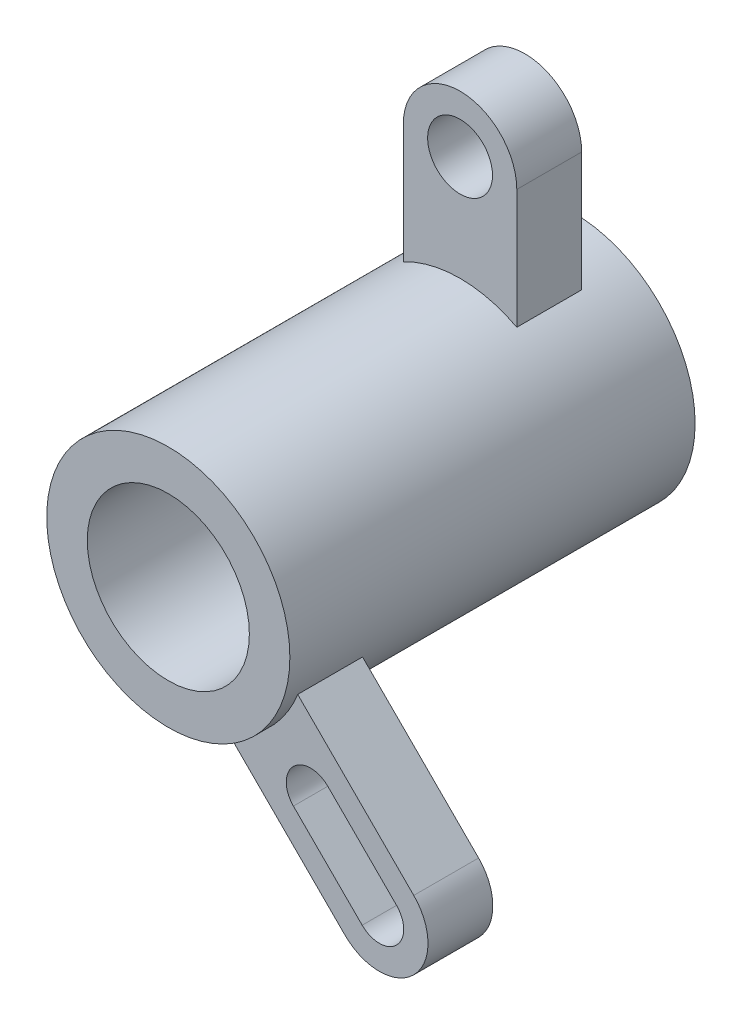
ISO-10303-21;
HEADER;
FILE_DESCRIPTION(('STEP AP214'),'2;1');
FILE_NAME('part.step','',(''),(''),'','','');
FILE_SCHEMA(('AUTOMOTIVE_DESIGN { 1 0 10303 214 1 1 1 1 }'));
ENDSEC;
DATA;
#1=APPLICATION_CONTEXT('core data for automotive mechanical design processes');
#2=APPLICATION_PROTOCOL_DEFINITION('international standard','automotive_design',2000,#1);
#3=PRODUCT_CONTEXT('',#1,'mechanical');
#4=PRODUCT('Part','Part','',(#3));
#5=PRODUCT_RELATED_PRODUCT_CATEGORY('part','',(#4));
#6=PRODUCT_DEFINITION_FORMATION('','',#4);
#7=PRODUCT_DEFINITION_CONTEXT('part definition',#1,'design');
#8=PRODUCT_DEFINITION('design','',#6,#7);
#9=PRODUCT_DEFINITION_SHAPE('','',#8);
#10=(LENGTH_UNIT() NAMED_UNIT(*) SI_UNIT(.MILLI.,.METRE.));
#11=(NAMED_UNIT(*) PLANE_ANGLE_UNIT() SI_UNIT($,.RADIAN.));
#12=(NAMED_UNIT(*) SI_UNIT($,.STERADIAN.) SOLID_ANGLE_UNIT());
#13=UNCERTAINTY_MEASURE_WITH_UNIT(LENGTH_MEASURE(1.E-05),#10,'distance_accuracy_value','');
#14=(GEOMETRIC_REPRESENTATION_CONTEXT(3) GLOBAL_UNCERTAINTY_ASSIGNED_CONTEXT((#13)) GLOBAL_UNIT_ASSIGNED_CONTEXT((#10,
#11,#12)) REPRESENTATION_CONTEXT('',''));
#15=CARTESIAN_POINT('',(0.,0.,0.));
#16=DIRECTION('',(0.,0.,1.));
#17=DIRECTION('',(1.,0.,0.));
#18=AXIS2_PLACEMENT_3D('',#15,#16,#17);
#19=CARTESIAN_POINT('',(0.,0.,25.));
#20=DIRECTION('',(0.,0.,-1.));
#21=DIRECTION('',(-1.,0.,0.));
#22=AXIS2_PLACEMENT_3D('',#19,#20,#21);
#23=CYLINDRICAL_SURFACE('',#22,7.5);
#24=DIRECTION('',(0.,0.,-1.));
#25=VECTOR('',#24,1.);
#26=CARTESIAN_POINT('',(2.73923518024622,-6.98187586736555,24.));
#27=LINE('',#26,#25);
#28=CARTESIAN_POINT('',(2.73923518024622,-6.98187586736555,24.));
#29=VERTEX_POINT('',#28);
#30=CARTESIAN_POINT('',(2.73923518024622,-6.98187586736555,20.));
#31=VERTEX_POINT('',#30);
#32=EDGE_CURVE('E65',#29,#31,#27,.T.);
#33=ORIENTED_EDGE('',*,*,#32,.F.);
#34=CARTESIAN_POINT('',(0.,0.,24.));
#35=DIRECTION('',(0.,0.,1.));
#36=DIRECTION('',(1.,0.,0.));
#37=AXIS2_PLACEMENT_3D('',#34,#35,#36);
#38=CIRCLE('',#37,7.5);
#39=CARTESIAN_POINT('',(6.98187586736552,-2.73923518024629,24.));
#40=VERTEX_POINT('',#39);
#41=EDGE_CURVE('E70',#29,#40,#38,.T.);
#42=ORIENTED_EDGE('',*,*,#41,.T.);
#43=DIRECTION('',(0.,0.,-1.));
#44=VECTOR('',#43,1.);
#45=CARTESIAN_POINT('',(6.98187586736552,-2.73923518024629,24.));
#46=LINE('',#45,#44);
#47=CARTESIAN_POINT('',(6.98187586736552,-2.73923518024629,20.));
#48=VERTEX_POINT('',#47);
#49=EDGE_CURVE('E199',#40,#48,#46,.T.);
#50=ORIENTED_EDGE('',*,*,#49,.T.);
#51=CARTESIAN_POINT('',(0.,0.,20.));
#52=DIRECTION('',(0.,0.,1.));
#53=DIRECTION('',(1.,0.,0.));
#54=AXIS2_PLACEMENT_3D('',#51,#52,#53);
#55=CIRCLE('',#54,7.5);
#56=EDGE_CURVE('E160',#31,#48,#55,.T.);
#57=ORIENTED_EDGE('',*,*,#56,.F.);
#58=EDGE_LOOP('',(#33,#42,#50,#57));
#59=FACE_BOUND('',#58,.T.);
#60=DIRECTION('',(0.,0.,-1.));
#61=VECTOR('',#60,1.);
#62=CARTESIAN_POINT('',(3.5,6.6332495807108,7.));
#63=LINE('',#62,#61);
#64=CARTESIAN_POINT('',(3.5,6.6332495807108,7.));
#65=VERTEX_POINT('',#64);
#66=CARTESIAN_POINT('',(3.5,6.6332495807108,3.));
#67=VERTEX_POINT('',#66);
#68=EDGE_CURVE('E225',#65,#67,#63,.T.);
#69=ORIENTED_EDGE('',*,*,#68,.F.);
#70=CARTESIAN_POINT('',(0.,0.,7.));
#71=DIRECTION('',(0.,0.,1.));
#72=DIRECTION('',(1.,0.,0.));
#73=AXIS2_PLACEMENT_3D('',#70,#71,#72);
#74=CIRCLE('',#73,7.5);
#75=CARTESIAN_POINT('',(-3.5,6.6332495807108,7.));
#76=VERTEX_POINT('',#75);
#77=EDGE_CURVE('E223',#65,#76,#74,.T.);
#78=ORIENTED_EDGE('',*,*,#77,.T.);
#79=DIRECTION('',(0.,0.,-1.));
#80=VECTOR('',#79,1.);
#81=CARTESIAN_POINT('',(-3.5,6.6332495807108,7.));
#82=LINE('',#81,#80);
#83=CARTESIAN_POINT('',(-3.5,6.6332495807108,3.));
#84=VERTEX_POINT('',#83);
#85=EDGE_CURVE('E241',#76,#84,#82,.T.);
#86=ORIENTED_EDGE('',*,*,#85,.T.);
#87=CARTESIAN_POINT('',(0.,0.,3.));
#88=DIRECTION('',(0.,0.,1.));
#89=DIRECTION('',(1.,0.,0.));
#90=AXIS2_PLACEMENT_3D('',#87,#88,#89);
#91=CIRCLE('',#90,7.5);
#92=EDGE_CURVE('E215',#67,#84,#91,.T.);
#93=ORIENTED_EDGE('',*,*,#92,.F.);
#94=EDGE_LOOP('',(#69,#78,#86,#93));
#95=FACE_BOUND('',#94,.T.);
#96=CARTESIAN_POINT('',(0.,0.,25.));
#97=DIRECTION('',(0.,0.,1.));
#98=DIRECTION('',(1.,0.,0.));
#99=AXIS2_PLACEMENT_3D('',#96,#97,#98);
#100=CIRCLE('',#99,7.5);
#101=CARTESIAN_POINT('',(7.5,0.,25.));
#102=VERTEX_POINT('',#101);
#103=EDGE_CURVE('E57',#102,#102,#100,.T.);
#104=ORIENTED_EDGE('',*,*,#103,.F.);
#105=EDGE_LOOP('',(#104));
#106=FACE_BOUND('',#105,.T.);
#107=CARTESIAN_POINT('',(0.,0.,0.));
#108=DIRECTION('',(0.,0.,1.));
#109=DIRECTION('',(1.,0.,0.));
#110=AXIS2_PLACEMENT_3D('',#107,#108,#109);
#111=CIRCLE('',#110,7.5);
#112=CARTESIAN_POINT('',(7.5,0.,0.));
#113=VERTEX_POINT('',#112);
#114=EDGE_CURVE('E248',#113,#113,#111,.T.);
#115=ORIENTED_EDGE('',*,*,#114,.T.);
#116=EDGE_LOOP('',(#115));
#117=FACE_BOUND('',#116,.T.);
#118=ADVANCED_FACE('F49',(#59,#95,#106,#117),#23,.T.);
#119=CARTESIAN_POINT('',(0.,0.,25.));
#120=DIRECTION('',(0.,0.,-1.));
#121=DIRECTION('',(-1.,0.,0.));
#122=AXIS2_PLACEMENT_3D('',#119,#120,#121);
#123=CYLINDRICAL_SURFACE('',#122,5.);
#124=CARTESIAN_POINT('',(0.,0.,25.));
#125=DIRECTION('',(0.,0.,1.));
#126=DIRECTION('',(1.,0.,0.));
#127=AXIS2_PLACEMENT_3D('',#124,#125,#126);
#128=CIRCLE('',#127,5.);
#129=CARTESIAN_POINT('',(5.,0.,25.));
#130=VERTEX_POINT('',#129);
#131=EDGE_CURVE('E13',#130,#130,#128,.T.);
#132=ORIENTED_EDGE('',*,*,#131,.T.);
#133=EDGE_LOOP('',(#132));
#134=FACE_BOUND('',#133,.T.);
#135=CARTESIAN_POINT('',(0.,0.,0.));
#136=DIRECTION('',(0.,0.,1.));
#137=DIRECTION('',(1.,0.,0.));
#138=AXIS2_PLACEMENT_3D('',#135,#136,#137);
#139=CIRCLE('',#138,5.);
#140=CARTESIAN_POINT('',(5.,0.,0.));
#141=VERTEX_POINT('',#140);
#142=EDGE_CURVE('E52',#141,#141,#139,.T.);
#143=ORIENTED_EDGE('',*,*,#142,.F.);
#144=EDGE_LOOP('',(#143));
#145=FACE_BOUND('',#144,.T.);
#146=ADVANCED_FACE('F258',(#134,#145),#123,.F.);
#147=CARTESIAN_POINT('',(0.,0.,25.));
#148=DIRECTION('',(0.,0.,1.));
#149=DIRECTION('',(1.,0.,0.));
#150=AXIS2_PLACEMENT_3D('',#147,#148,#149);
#151=PLANE('',#150);
#152=ORIENTED_EDGE('',*,*,#103,.T.);
#153=EDGE_LOOP('',(#152));
#154=FACE_BOUND('',#153,.T.);
#155=ORIENTED_EDGE('',*,*,#131,.F.);
#156=EDGE_LOOP('',(#155));
#157=FACE_BOUND('',#156,.T.);
#158=ADVANCED_FACE('F260',(#154,#157),#151,.T.);
#159=CARTESIAN_POINT('',(0.,0.,0.));
#160=DIRECTION('',(0.,0.,1.));
#161=DIRECTION('',(1.,0.,0.));
#162=AXIS2_PLACEMENT_3D('',#159,#160,#161);
#163=PLANE('',#162);
#164=ORIENTED_EDGE('',*,*,#114,.F.);
#165=EDGE_LOOP('',(#164));
#166=FACE_BOUND('',#165,.T.);
#167=ORIENTED_EDGE('',*,*,#142,.T.);
#168=EDGE_LOOP('',(#167));
#169=FACE_BOUND('',#168,.T.);
#170=ADVANCED_FACE('F256',(#166,#169),#163,.F.);
#171=CARTESIAN_POINT('',(3.5,0.,7.));
#172=DIRECTION('',(-1.,0.,0.));
#173=DIRECTION('',(0.,0.,1.));
#174=AXIS2_PLACEMENT_3D('',#171,#172,#173);
#175=PLANE('',#174);
#176=DIRECTION('',(0.,1.,0.));
#177=VECTOR('',#176,1.);
#178=CARTESIAN_POINT('',(3.5,0.,3.));
#179=LINE('',#178,#177);
#180=CARTESIAN_POINT('',(3.5,14.,3.));
#181=VERTEX_POINT('',#180);
#182=EDGE_CURVE('E228',#67,#181,#179,.T.);
#183=ORIENTED_EDGE('',*,*,#182,.T.);
#184=DIRECTION('',(0.,0.,-1.));
#185=VECTOR('',#184,1.);
#186=CARTESIAN_POINT('',(3.5,14.,7.));
#187=LINE('',#186,#185);
#188=CARTESIAN_POINT('',(3.5,14.,7.));
#189=VERTEX_POINT('',#188);
#190=EDGE_CURVE('E245',#189,#181,#187,.T.);
#191=ORIENTED_EDGE('',*,*,#190,.F.);
#192=DIRECTION('',(0.,1.,0.));
#193=VECTOR('',#192,1.);
#194=CARTESIAN_POINT('',(3.5,0.,7.));
#195=LINE('',#194,#193);
#196=EDGE_CURVE('E214',#65,#189,#195,.T.);
#197=ORIENTED_EDGE('',*,*,#196,.F.);
#198=ORIENTED_EDGE('',*,*,#68,.T.);
#199=EDGE_LOOP('',(#183,#191,#197,#198));
#200=FACE_BOUND('',#199,.T.);
#201=ADVANCED_FACE('F270',(#200),#175,.F.);
#202=CARTESIAN_POINT('',(0.,14.,7.));
#203=DIRECTION('',(0.,0.,-1.));
#204=DIRECTION('',(-1.,0.,0.));
#205=AXIS2_PLACEMENT_3D('',#202,#203,#204);
#206=CYLINDRICAL_SURFACE('',#205,3.5);
#207=CARTESIAN_POINT('',(0.,14.,3.));
#208=DIRECTION('',(0.,0.,1.));
#209=DIRECTION('',(1.,0.,0.));
#210=AXIS2_PLACEMENT_3D('',#207,#208,#209);
#211=CIRCLE('',#210,3.5);
#212=CARTESIAN_POINT('',(-3.5,14.,3.));
#213=VERTEX_POINT('',#212);
#214=EDGE_CURVE('E231',#181,#213,#211,.T.);
#215=ORIENTED_EDGE('',*,*,#214,.T.);
#216=DIRECTION('',(0.,0.,-1.));
#217=VECTOR('',#216,1.);
#218=CARTESIAN_POINT('',(-3.5,14.,7.));
#219=LINE('',#218,#217);
#220=CARTESIAN_POINT('',(-3.5,14.,7.));
#221=VERTEX_POINT('',#220);
#222=EDGE_CURVE('E243',#221,#213,#219,.T.);
#223=ORIENTED_EDGE('',*,*,#222,.F.);
#224=CARTESIAN_POINT('',(0.,14.,7.));
#225=DIRECTION('',(0.,0.,1.));
#226=DIRECTION('',(1.,0.,0.));
#227=AXIS2_PLACEMENT_3D('',#224,#225,#226);
#228=CIRCLE('',#227,3.5);
#229=EDGE_CURVE('E218',#189,#221,#228,.T.);
#230=ORIENTED_EDGE('',*,*,#229,.F.);
#231=ORIENTED_EDGE('',*,*,#190,.T.);
#232=EDGE_LOOP('',(#215,#223,#230,#231));
#233=FACE_BOUND('',#232,.T.);
#234=ADVANCED_FACE('F281',(#233),#206,.T.);
#235=CARTESIAN_POINT('',(-3.5,0.,7.));
#236=DIRECTION('',(-1.,0.,0.));
#237=DIRECTION('',(0.,0.,1.));
#238=AXIS2_PLACEMENT_3D('',#235,#236,#237);
#239=PLANE('',#238);
#240=DIRECTION('',(0.,1.,0.));
#241=VECTOR('',#240,1.);
#242=CARTESIAN_POINT('',(-3.5,0.,3.));
#243=LINE('',#242,#241);
#244=EDGE_CURVE('E234',#84,#213,#243,.T.);
#245=ORIENTED_EDGE('',*,*,#244,.F.);
#246=ORIENTED_EDGE('',*,*,#85,.F.);
#247=DIRECTION('',(0.,1.,0.));
#248=VECTOR('',#247,1.);
#249=CARTESIAN_POINT('',(-3.5,0.,7.));
#250=LINE('',#249,#248);
#251=EDGE_CURVE('E220',#76,#221,#250,.T.);
#252=ORIENTED_EDGE('',*,*,#251,.T.);
#253=ORIENTED_EDGE('',*,*,#222,.T.);
#254=EDGE_LOOP('',(#245,#246,#252,#253));
#255=FACE_BOUND('',#254,.T.);
#256=ADVANCED_FACE('F277',(#255),#239,.T.);
#257=CARTESIAN_POINT('',(0.,14.,7.));
#258=DIRECTION('',(0.,0.,-1.));
#259=DIRECTION('',(-1.,0.,0.));
#260=AXIS2_PLACEMENT_3D('',#257,#258,#259);
#261=CYLINDRICAL_SURFACE('',#260,2.);
#262=CARTESIAN_POINT('',(0.,14.,7.));
#263=DIRECTION('',(0.,0.,1.));
#264=DIRECTION('',(1.,0.,0.));
#265=AXIS2_PLACEMENT_3D('',#262,#263,#264);
#266=CIRCLE('',#265,2.);
#267=CARTESIAN_POINT('',(2.,14.,7.));
#268=VERTEX_POINT('',#267);
#269=EDGE_CURVE('E211',#268,#268,#266,.T.);
#270=ORIENTED_EDGE('',*,*,#269,.T.);
#271=EDGE_LOOP('',(#270));
#272=FACE_BOUND('',#271,.T.);
#273=CARTESIAN_POINT('',(0.,14.,3.));
#274=DIRECTION('',(0.,0.,1.));
#275=DIRECTION('',(1.,0.,0.));
#276=AXIS2_PLACEMENT_3D('',#273,#274,#275);
#277=CIRCLE('',#276,2.);
#278=CARTESIAN_POINT('',(2.,14.,3.));
#279=VERTEX_POINT('',#278);
#280=EDGE_CURVE('E206',#279,#279,#277,.T.);
#281=ORIENTED_EDGE('',*,*,#280,.F.);
#282=EDGE_LOOP('',(#281));
#283=FACE_BOUND('',#282,.T.);
#284=ADVANCED_FACE('F273',(#272,#283),#261,.F.);
#285=CARTESIAN_POINT('',(0.,0.,7.));
#286=DIRECTION('',(0.,0.,1.));
#287=DIRECTION('',(1.,0.,0.));
#288=AXIS2_PLACEMENT_3D('',#285,#286,#287);
#289=PLANE('',#288);
#290=ORIENTED_EDGE('',*,*,#269,.F.);
#291=EDGE_LOOP('',(#290));
#292=FACE_BOUND('',#291,.T.);
#293=ORIENTED_EDGE('',*,*,#196,.T.);
#294=ORIENTED_EDGE('',*,*,#229,.T.);
#295=ORIENTED_EDGE('',*,*,#251,.F.);
#296=ORIENTED_EDGE('',*,*,#77,.F.);
#297=EDGE_LOOP('',(#293,#294,#295,#296));
#298=FACE_BOUND('',#297,.T.);
#299=ADVANCED_FACE('F276',(#292,#298),#289,.T.);
#300=CARTESIAN_POINT('',(0.,0.,3.));
#301=DIRECTION('',(0.,0.,1.));
#302=DIRECTION('',(1.,0.,0.));
#303=AXIS2_PLACEMENT_3D('',#300,#301,#302);
#304=PLANE('',#303);
#305=ORIENTED_EDGE('',*,*,#280,.T.);
#306=EDGE_LOOP('',(#305));
#307=FACE_BOUND('',#306,.T.);
#308=ORIENTED_EDGE('',*,*,#182,.F.);
#309=ORIENTED_EDGE('',*,*,#92,.T.);
#310=ORIENTED_EDGE('',*,*,#244,.T.);
#311=ORIENTED_EDGE('',*,*,#214,.F.);
#312=EDGE_LOOP('',(#308,#309,#310,#311));
#313=FACE_BOUND('',#312,.T.);
#314=ADVANCED_FACE('F289',(#307,#313),#304,.F.);
#315=CARTESIAN_POINT('',(-2.12132034355965,-2.12132034355963,24.));
#316=DIRECTION('',(0.707106781186551,0.707106781186544,0.));
#317=DIRECTION('',(-0.707106781186544,0.707106781186551,0.));
#318=AXIS2_PLACEMENT_3D('',#315,#316,#317);
#319=PLANE('',#318);
#320=DIRECTION('',(0.707106781186544,-0.707106781186551,0.));
#321=VECTOR('',#320,1.);
#322=CARTESIAN_POINT('',(-2.12132034355965,-2.12132034355963,20.));
#323=LINE('',#322,#321);
#324=CARTESIAN_POINT('',(9.8994949366116,-14.142135623731,20.));
#325=VERTEX_POINT('',#324);
#326=EDGE_CURVE('E187',#31,#325,#323,.T.);
#327=ORIENTED_EDGE('',*,*,#326,.T.);
#328=DIRECTION('',(0.,0.,-1.));
#329=VECTOR('',#328,1.);
#330=CARTESIAN_POINT('',(9.8994949366116,-14.142135623731,24.));
#331=LINE('',#330,#329);
#332=CARTESIAN_POINT('',(9.8994949366116,-14.142135623731,24.));
#333=VERTEX_POINT('',#332);
#334=EDGE_CURVE('E203',#333,#325,#331,.T.);
#335=ORIENTED_EDGE('',*,*,#334,.F.);
#336=DIRECTION('',(0.707106781186544,-0.707106781186551,0.));
#337=VECTOR('',#336,1.);
#338=CARTESIAN_POINT('',(-2.12132034355965,-2.12132034355963,24.));
#339=LINE('',#338,#337);
#340=EDGE_CURVE('E168',#29,#333,#339,.T.);
#341=ORIENTED_EDGE('',*,*,#340,.F.);
#342=ORIENTED_EDGE('',*,*,#32,.T.);
#343=EDGE_LOOP('',(#327,#335,#341,#342));
#344=FACE_BOUND('',#343,.T.);
#345=ADVANCED_FACE('F292',(#344),#319,.F.);
#346=CARTESIAN_POINT('',(12.0208152801712,-12.0208152801714,24.));
#347=DIRECTION('',(0.,0.,-1.));
#348=DIRECTION('',(-1.,0.,0.));
#349=AXIS2_PLACEMENT_3D('',#346,#347,#348);
#350=CYLINDRICAL_SURFACE('',#349,2.99999999999999);
#351=CARTESIAN_POINT('',(12.0208152801712,-12.0208152801714,20.));
#352=DIRECTION('',(0.,0.,1.));
#353=DIRECTION('',(1.,0.,0.));
#354=AXIS2_PLACEMENT_3D('',#351,#352,#353);
#355=CIRCLE('',#354,2.99999999999999);
#356=CARTESIAN_POINT('',(14.1421356237309,-9.89949493661174,20.));
#357=VERTEX_POINT('',#356);
#358=EDGE_CURVE('E190',#325,#357,#355,.T.);
#359=ORIENTED_EDGE('',*,*,#358,.T.);
#360=DIRECTION('',(0.,0.,-1.));
#361=VECTOR('',#360,1.);
#362=CARTESIAN_POINT('',(14.1421356237309,-9.89949493661174,24.));
#363=LINE('',#362,#361);
#364=CARTESIAN_POINT('',(14.1421356237309,-9.89949493661174,24.));
#365=VERTEX_POINT('',#364);
#366=EDGE_CURVE('E201',#365,#357,#363,.T.);
#367=ORIENTED_EDGE('',*,*,#366,.F.);
#368=CARTESIAN_POINT('',(12.0208152801712,-12.0208152801714,24.));
#369=DIRECTION('',(0.,0.,1.));
#370=DIRECTION('',(1.,0.,0.));
#371=AXIS2_PLACEMENT_3D('',#368,#369,#370);
#372=CIRCLE('',#371,2.99999999999999);
#373=EDGE_CURVE('E171',#333,#365,#372,.T.);
#374=ORIENTED_EDGE('',*,*,#373,.F.);
#375=ORIENTED_EDGE('',*,*,#334,.T.);
#376=EDGE_LOOP('',(#359,#367,#374,#375));
#377=FACE_BOUND('',#376,.T.);
#378=ADVANCED_FACE('F312',(#377),#350,.T.);
#379=CARTESIAN_POINT('',(2.12132034355965,2.12132034355963,24.));
#380=DIRECTION('',(0.707106781186551,0.707106781186544,0.));
#381=DIRECTION('',(-0.707106781186544,0.707106781186551,0.));
#382=AXIS2_PLACEMENT_3D('',#379,#380,#381);
#383=PLANE('',#382);
#384=DIRECTION('',(0.707106781186544,-0.707106781186551,0.));
#385=VECTOR('',#384,1.);
#386=CARTESIAN_POINT('',(2.12132034355965,2.12132034355963,20.));
#387=LINE('',#386,#385);
#388=EDGE_CURVE('E193',#48,#357,#387,.T.);
#389=ORIENTED_EDGE('',*,*,#388,.F.);
#390=ORIENTED_EDGE('',*,*,#49,.F.);
#391=DIRECTION('',(0.707106781186544,-0.707106781186551,0.));
#392=VECTOR('',#391,1.);
#393=CARTESIAN_POINT('',(2.12132034355965,2.12132034355963,24.));
#394=LINE('',#393,#392);
#395=EDGE_CURVE('E173',#40,#365,#394,.T.);
#396=ORIENTED_EDGE('',*,*,#395,.T.);
#397=ORIENTED_EDGE('',*,*,#366,.T.);
#398=EDGE_LOOP('',(#389,#390,#396,#397));
#399=FACE_BOUND('',#398,.T.);
#400=ADVANCED_FACE('F299',(#399),#383,.T.);
#401=CARTESIAN_POINT('',(7.77817459305198,-7.77817459305206,24.));
#402=DIRECTION('',(0.,0.,-1.));
#403=DIRECTION('',(-1.,0.,0.));
#404=AXIS2_PLACEMENT_3D('',#401,#402,#403);
#405=CYLINDRICAL_SURFACE('',#404,1.5);
#406=CARTESIAN_POINT('',(7.77817459305198,-7.77817459305206,20.));
#407=DIRECTION('',(0.,0.,1.));
#408=DIRECTION('',(1.,0.,0.));
#409=AXIS2_PLACEMENT_3D('',#406,#407,#408);
#410=CIRCLE('',#409,1.5);
#411=CARTESIAN_POINT('',(8.83883476483181,-6.71751442127225,20.));
#412=VERTEX_POINT('',#411);
#413=CARTESIAN_POINT('',(6.71751442127216,-8.83883476483188,20.));
#414=VERTEX_POINT('',#413);
#415=EDGE_CURVE('E143',#412,#414,#410,.T.);
#416=ORIENTED_EDGE('',*,*,#415,.F.);
#417=DIRECTION('',(0.,0.,-1.));
#418=VECTOR('',#417,1.);
#419=CARTESIAN_POINT('',(8.83883476483181,-6.71751442127225,24.));
#420=LINE('',#419,#418);
#421=CARTESIAN_POINT('',(8.83883476483181,-6.71751442127225,24.));
#422=VERTEX_POINT('',#421);
#423=EDGE_CURVE('E138',#422,#412,#420,.T.);
#424=ORIENTED_EDGE('',*,*,#423,.F.);
#425=CARTESIAN_POINT('',(7.77817459305198,-7.77817459305206,24.));
#426=DIRECTION('',(0.,0.,1.));
#427=DIRECTION('',(1.,0.,0.));
#428=AXIS2_PLACEMENT_3D('',#425,#426,#427);
#429=CIRCLE('',#428,1.5);
#430=CARTESIAN_POINT('',(6.71751442127216,-8.83883476483188,24.));
#431=VERTEX_POINT('',#430);
#432=EDGE_CURVE('E141',#422,#431,#429,.T.);
#433=ORIENTED_EDGE('',*,*,#432,.T.);
#434=DIRECTION('',(0.,0.,-1.));
#435=VECTOR('',#434,1.);
#436=CARTESIAN_POINT('',(6.71751442127216,-8.83883476483188,24.));
#437=LINE('',#436,#435);
#438=EDGE_CURVE('E177',#431,#414,#437,.T.);
#439=ORIENTED_EDGE('',*,*,#438,.T.);
#440=EDGE_LOOP('',(#416,#424,#433,#439));
#441=FACE_BOUND('',#440,.T.);
#442=ADVANCED_FACE('F140',(#441),#405,.F.);
#443=CARTESIAN_POINT('',(1.06066017177983,1.06066017177982,24.));
#444=DIRECTION('',(-0.707106781186552,-0.707106781186544,0.));
#445=DIRECTION('',(0.707106781186544,-0.707106781186551,0.));
#446=AXIS2_PLACEMENT_3D('',#443,#444,#445);
#447=PLANE('',#446);
#448=DIRECTION('',(-0.707106781186544,0.707106781186551,0.));
#449=VECTOR('',#448,1.);
#450=CARTESIAN_POINT('',(1.06066017177983,1.06066017177982,20.));
#451=LINE('',#450,#449);
#452=CARTESIAN_POINT('',(13.0814754519511,-10.9601551083916,20.));
#453=VERTEX_POINT('',#452);
#454=EDGE_CURVE('E179',#453,#412,#451,.T.);
#455=ORIENTED_EDGE('',*,*,#454,.F.);
#456=DIRECTION('',(0.,0.,-1.));
#457=VECTOR('',#456,1.);
#458=CARTESIAN_POINT('',(13.0814754519511,-10.9601551083916,24.));
#459=LINE('',#458,#457);
#460=CARTESIAN_POINT('',(13.0814754519511,-10.9601551083916,24.));
#461=VERTEX_POINT('',#460);
#462=EDGE_CURVE('E148',#461,#453,#459,.T.);
#463=ORIENTED_EDGE('',*,*,#462,.F.);
#464=DIRECTION('',(-0.707106781186544,0.707106781186551,0.));
#465=VECTOR('',#464,1.);
#466=CARTESIAN_POINT('',(1.06066017177983,1.06066017177982,24.));
#467=LINE('',#466,#465);
#468=EDGE_CURVE('E155',#461,#422,#467,.T.);
#469=ORIENTED_EDGE('',*,*,#468,.T.);
#470=ORIENTED_EDGE('',*,*,#423,.T.);
#471=EDGE_LOOP('',(#455,#463,#469,#470));
#472=FACE_BOUND('',#471,.T.);
#473=ADVANCED_FACE('F162',(#472),#447,.T.);
#474=CARTESIAN_POINT('',(12.0208152801712,-12.0208152801714,24.));
#475=DIRECTION('',(0.,0.,-1.));
#476=DIRECTION('',(-1.,0.,0.));
#477=AXIS2_PLACEMENT_3D('',#474,#475,#476);
#478=CYLINDRICAL_SURFACE('',#477,1.5);
#479=CARTESIAN_POINT('',(12.0208152801712,-12.0208152801714,20.));
#480=DIRECTION('',(0.,0.,1.));
#481=DIRECTION('',(1.,0.,0.));
#482=AXIS2_PLACEMENT_3D('',#479,#480,#481);
#483=CIRCLE('',#482,1.5);
#484=CARTESIAN_POINT('',(10.9601551083914,-13.0814754519512,20.));
#485=VERTEX_POINT('',#484);
#486=EDGE_CURVE('E181',#485,#453,#483,.T.);
#487=ORIENTED_EDGE('',*,*,#486,.F.);
#488=DIRECTION('',(0.,0.,-1.));
#489=VECTOR('',#488,1.);
#490=CARTESIAN_POINT('',(10.9601551083914,-13.0814754519512,24.));
#491=LINE('',#490,#489);
#492=CARTESIAN_POINT('',(10.9601551083914,-13.0814754519512,24.));
#493=VERTEX_POINT('',#492);
#494=EDGE_CURVE('E208',#493,#485,#491,.T.);
#495=ORIENTED_EDGE('',*,*,#494,.F.);
#496=CARTESIAN_POINT('',(12.0208152801712,-12.0208152801714,24.));
#497=DIRECTION('',(0.,0.,1.));
#498=DIRECTION('',(1.,0.,0.));
#499=AXIS2_PLACEMENT_3D('',#496,#497,#498);
#500=CIRCLE('',#499,1.5);
#501=EDGE_CURVE('E163',#493,#461,#500,.T.);
#502=ORIENTED_EDGE('',*,*,#501,.T.);
#503=ORIENTED_EDGE('',*,*,#462,.T.);
#504=EDGE_LOOP('',(#487,#495,#502,#503));
#505=FACE_BOUND('',#504,.T.);
#506=ADVANCED_FACE('F302',(#505),#478,.F.);
#507=CARTESIAN_POINT('',(-1.06066017177983,-1.06066017177982,24.));
#508=DIRECTION('',(-0.707106781186551,-0.707106781186544,0.));
#509=DIRECTION('',(0.707106781186544,-0.707106781186551,0.));
#510=AXIS2_PLACEMENT_3D('',#507,#508,#509);
#511=PLANE('',#510);
#512=DIRECTION('',(-0.707106781186544,0.707106781186551,0.));
#513=VECTOR('',#512,1.);
#514=CARTESIAN_POINT('',(-1.06066017177983,-1.06066017177982,20.));
#515=LINE('',#514,#513);
#516=EDGE_CURVE('E184',#485,#414,#515,.T.);
#517=ORIENTED_EDGE('',*,*,#516,.T.);
#518=ORIENTED_EDGE('',*,*,#438,.F.);
#519=DIRECTION('',(-0.707106781186544,0.707106781186551,0.));
#520=VECTOR('',#519,1.);
#521=CARTESIAN_POINT('',(-1.06066017177983,-1.06066017177982,24.));
#522=LINE('',#521,#520);
#523=EDGE_CURVE('E158',#493,#431,#522,.T.);
#524=ORIENTED_EDGE('',*,*,#523,.F.);
#525=ORIENTED_EDGE('',*,*,#494,.T.);
#526=EDGE_LOOP('',(#517,#518,#524,#525));
#527=FACE_BOUND('',#526,.T.);
#528=ADVANCED_FACE('F305',(#527),#511,.F.);
#529=CARTESIAN_POINT('',(0.,0.,24.));
#530=DIRECTION('',(0.,0.,1.));
#531=DIRECTION('',(1.,0.,0.));
#532=AXIS2_PLACEMENT_3D('',#529,#530,#531);
#533=PLANE('',#532);
#534=ORIENTED_EDGE('',*,*,#432,.F.);
#535=ORIENTED_EDGE('',*,*,#468,.F.);
#536=ORIENTED_EDGE('',*,*,#501,.F.);
#537=ORIENTED_EDGE('',*,*,#523,.T.);
#538=EDGE_LOOP('',(#534,#535,#536,#537));
#539=FACE_BOUND('',#538,.T.);
#540=ORIENTED_EDGE('',*,*,#340,.T.);
#541=ORIENTED_EDGE('',*,*,#373,.T.);
#542=ORIENTED_EDGE('',*,*,#395,.F.);
#543=ORIENTED_EDGE('',*,*,#41,.F.);
#544=EDGE_LOOP('',(#540,#541,#542,#543));
#545=FACE_BOUND('',#544,.T.);
#546=ADVANCED_FACE('F152',(#539,#545),#533,.T.);
#547=CARTESIAN_POINT('',(0.,0.,20.));
#548=DIRECTION('',(0.,0.,1.));
#549=DIRECTION('',(1.,0.,0.));
#550=AXIS2_PLACEMENT_3D('',#547,#548,#549);
#551=PLANE('',#550);
#552=ORIENTED_EDGE('',*,*,#415,.T.);
#553=ORIENTED_EDGE('',*,*,#516,.F.);
#554=ORIENTED_EDGE('',*,*,#486,.T.);
#555=ORIENTED_EDGE('',*,*,#454,.T.);
#556=EDGE_LOOP('',(#552,#553,#554,#555));
#557=FACE_BOUND('',#556,.T.);
#558=ORIENTED_EDGE('',*,*,#326,.F.);
#559=ORIENTED_EDGE('',*,*,#56,.T.);
#560=ORIENTED_EDGE('',*,*,#388,.T.);
#561=ORIENTED_EDGE('',*,*,#358,.F.);
#562=EDGE_LOOP('',(#558,#559,#560,#561));
#563=FACE_BOUND('',#562,.T.);
#564=ADVANCED_FACE('F320',(#557,#563),#551,.F.);
#565=CLOSED_SHELL('',(#118,#146,#158,#170,#201,#234,#256,#284,#299,#314,#345,#378,#400,#442,
#473,#506,#528,#546,#564));
#566=MANIFOLD_SOLID_BREP('B2',#565);
#567=ADVANCED_BREP_SHAPE_REPRESENTATION('',(#18,#566),#14);
#568=SHAPE_DEFINITION_REPRESENTATION(#9,#567);
ENDSEC;
END-ISO-10303-21;
